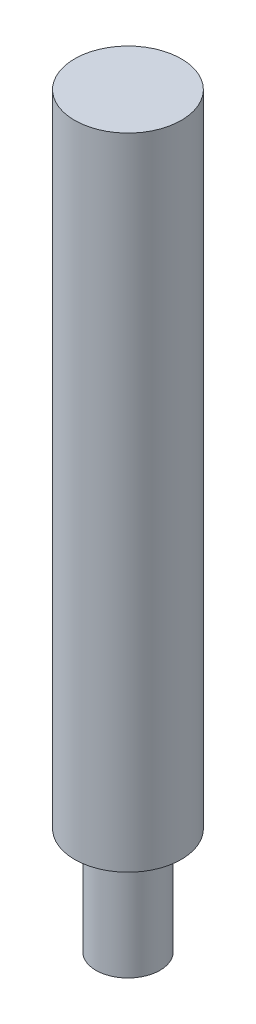
ISO-10303-21;
HEADER;
FILE_DESCRIPTION(('STEP AP214'),'2;1');
FILE_NAME('part.step','',(''),(''),'','','');
FILE_SCHEMA(('AUTOMOTIVE_DESIGN { 1 0 10303 214 1 1 1 1 }'));
ENDSEC;
DATA;
#1=APPLICATION_CONTEXT('core data for automotive mechanical design processes');
#2=APPLICATION_PROTOCOL_DEFINITION('international standard','automotive_design',2000,#1);
#3=PRODUCT_CONTEXT('',#1,'mechanical');
#4=PRODUCT('Part','Part','',(#3));
#5=PRODUCT_RELATED_PRODUCT_CATEGORY('part','',(#4));
#6=PRODUCT_DEFINITION_FORMATION('','',#4);
#7=PRODUCT_DEFINITION_CONTEXT('part definition',#1,'design');
#8=PRODUCT_DEFINITION('design','',#6,#7);
#9=PRODUCT_DEFINITION_SHAPE('','',#8);
#10=(LENGTH_UNIT() NAMED_UNIT(*) SI_UNIT(.MILLI.,.METRE.));
#11=(NAMED_UNIT(*) PLANE_ANGLE_UNIT() SI_UNIT($,.RADIAN.));
#12=(NAMED_UNIT(*) SI_UNIT($,.STERADIAN.) SOLID_ANGLE_UNIT());
#13=UNCERTAINTY_MEASURE_WITH_UNIT(LENGTH_MEASURE(1.E-05),#10,'distance_accuracy_value','');
#14=(GEOMETRIC_REPRESENTATION_CONTEXT(3) GLOBAL_UNCERTAINTY_ASSIGNED_CONTEXT((#13)) GLOBAL_UNIT_ASSIGNED_CONTEXT((#10,
#11,#12)) REPRESENTATION_CONTEXT('',''));
#15=CARTESIAN_POINT('',(0.,0.,0.));
#16=DIRECTION('',(0.,0.,1.));
#17=DIRECTION('',(1.,0.,0.));
#18=AXIS2_PLACEMENT_3D('',#15,#16,#17);
#19=CARTESIAN_POINT('',(0.,30.,0.));
#20=DIRECTION('',(0.,-1.,0.));
#21=DIRECTION('',(0.,0.,-1.));
#22=AXIS2_PLACEMENT_3D('',#19,#20,#21);
#23=CYLINDRICAL_SURFACE('',#22,2.5);
#24=CARTESIAN_POINT('',(0.,30.,0.));
#25=DIRECTION('',(0.,1.,0.));
#26=DIRECTION('',(0.,0.,1.));
#27=AXIS2_PLACEMENT_3D('',#24,#25,#26);
#28=CIRCLE('',#27,2.5);
#29=CARTESIAN_POINT('',(0.,30.,2.5));
#30=VERTEX_POINT('',#29);
#31=EDGE_CURVE('E37',#30,#30,#28,.T.);
#32=ORIENTED_EDGE('',*,*,#31,.F.);
#33=EDGE_LOOP('',(#32));
#34=FACE_BOUND('',#33,.T.);
#35=CARTESIAN_POINT('',(0.,0.,0.));
#36=DIRECTION('',(0.,1.,0.));
#37=DIRECTION('',(0.,0.,1.));
#38=AXIS2_PLACEMENT_3D('',#35,#36,#37);
#39=CIRCLE('',#38,2.5);
#40=CARTESIAN_POINT('',(0.,0.,2.5));
#41=VERTEX_POINT('',#40);
#42=EDGE_CURVE('E41',#41,#41,#39,.T.);
#43=ORIENTED_EDGE('',*,*,#42,.T.);
#44=EDGE_LOOP('',(#43));
#45=FACE_BOUND('',#44,.T.);
#46=ADVANCED_FACE('F31',(#34,#45),#23,.T.);
#47=CARTESIAN_POINT('',(0.,30.,0.));
#48=DIRECTION('',(0.,1.,0.));
#49=DIRECTION('',(0.,0.,1.));
#50=AXIS2_PLACEMENT_3D('',#47,#48,#49);
#51=PLANE('',#50);
#52=ORIENTED_EDGE('',*,*,#31,.T.);
#53=EDGE_LOOP('',(#52));
#54=FACE_BOUND('',#53,.T.);
#55=ADVANCED_FACE('F62',(#54),#51,.T.);
#56=CARTESIAN_POINT('',(0.,0.,0.));
#57=DIRECTION('',(0.,1.,0.));
#58=DIRECTION('',(0.,0.,1.));
#59=AXIS2_PLACEMENT_3D('',#56,#57,#58);
#60=PLANE('',#59);
#61=CARTESIAN_POINT('',(0.,0.,0.));
#62=DIRECTION('',(0.,1.,0.));
#63=DIRECTION('',(0.,0.,1.));
#64=AXIS2_PLACEMENT_3D('',#61,#62,#63);
#65=CIRCLE('',#64,1.5);
#66=CARTESIAN_POINT('',(0.,0.,1.5));
#67=VERTEX_POINT('',#66);
#68=EDGE_CURVE('E10',#67,#67,#65,.F.);
#69=ORIENTED_EDGE('',*,*,#68,.F.);
#70=EDGE_LOOP('',(#69));
#71=FACE_BOUND('',#70,.T.);
#72=ORIENTED_EDGE('',*,*,#42,.F.);
#73=EDGE_LOOP('',(#72));
#74=FACE_BOUND('',#73,.T.);
#75=ADVANCED_FACE('F55',(#71,#74),#60,.F.);
#76=CARTESIAN_POINT('',(0.,-5.,0.));
#77=DIRECTION('',(0.,1.,0.));
#78=DIRECTION('',(0.,0.,1.));
#79=AXIS2_PLACEMENT_3D('',#76,#77,#78);
#80=CYLINDRICAL_SURFACE('',#79,1.5);
#81=CARTESIAN_POINT('',(0.,-5.,0.));
#82=DIRECTION('',(0.,-1.,0.));
#83=DIRECTION('',(0.,0.,-1.));
#84=AXIS2_PLACEMENT_3D('',#81,#82,#83);
#85=CIRCLE('',#84,1.5);
#86=CARTESIAN_POINT('',(0.,-5.,-1.5));
#87=VERTEX_POINT('',#86);
#88=EDGE_CURVE('E46',#87,#87,#85,.T.);
#89=ORIENTED_EDGE('',*,*,#88,.F.);
#90=EDGE_LOOP('',(#89));
#91=FACE_BOUND('',#90,.T.);
#92=ORIENTED_EDGE('',*,*,#68,.T.);
#93=EDGE_LOOP('',(#92));
#94=FACE_BOUND('',#93,.T.);
#95=ADVANCED_FACE('F53',(#91,#94),#80,.T.);
#96=CARTESIAN_POINT('',(0.,-5.,0.));
#97=DIRECTION('',(0.,-1.,0.));
#98=DIRECTION('',(0.,0.,-1.));
#99=AXIS2_PLACEMENT_3D('',#96,#97,#98);
#100=PLANE('',#99);
#101=ORIENTED_EDGE('',*,*,#88,.T.);
#102=EDGE_LOOP('',(#101));
#103=FACE_BOUND('',#102,.T.);
#104=ADVANCED_FACE('F51',(#103),#100,.T.);
#105=CLOSED_SHELL('',(#46,#55,#75,#95,#104));
#106=MANIFOLD_SOLID_BREP('B2',#105);
#107=ADVANCED_BREP_SHAPE_REPRESENTATION('',(#18,#106),#14);
#108=SHAPE_DEFINITION_REPRESENTATION(#9,#107);
ENDSEC;
END-ISO-10303-21;
